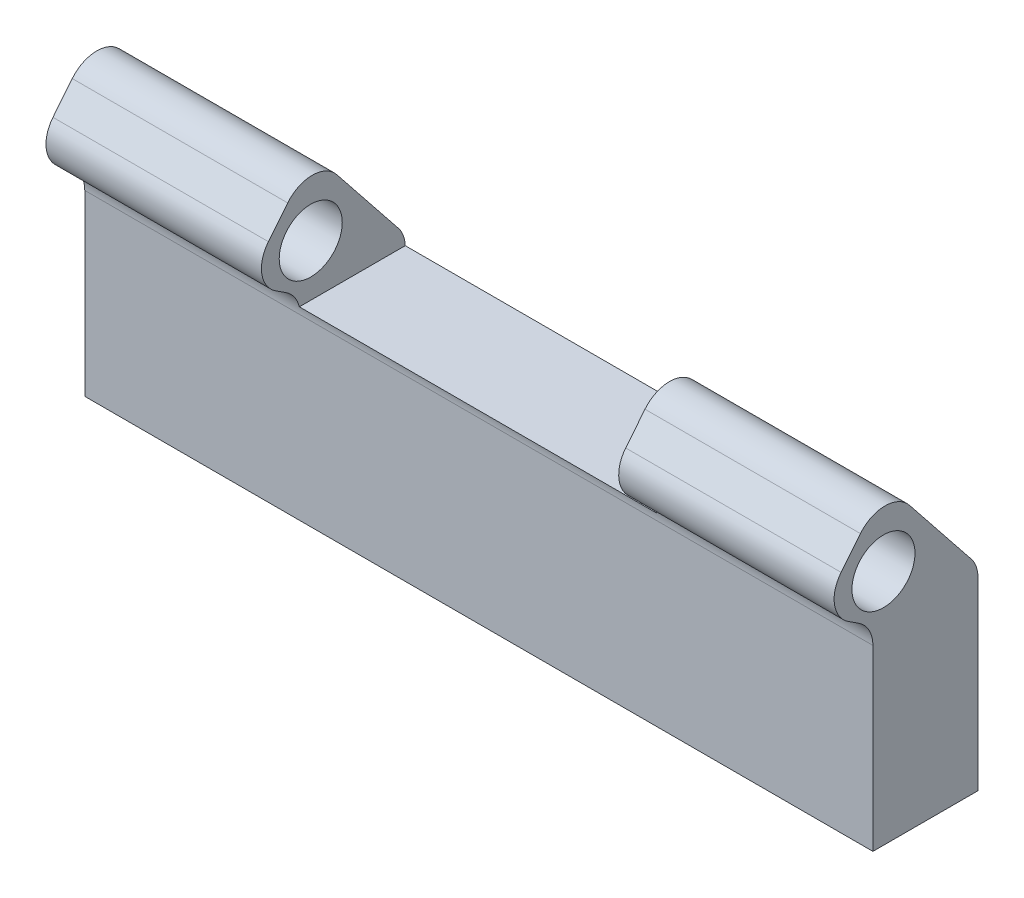
ISO-10303-21;
HEADER;
FILE_DESCRIPTION(('STEP AP214'),'2;1');
FILE_NAME('part.step','',(''),(''),'','','');
FILE_SCHEMA(('AUTOMOTIVE_DESIGN { 1 0 10303 214 1 1 1 1 }'));
ENDSEC;
DATA;
#1=APPLICATION_CONTEXT('core data for automotive mechanical design processes');
#2=APPLICATION_PROTOCOL_DEFINITION('international standard','automotive_design',2000,#1);
#3=PRODUCT_CONTEXT('',#1,'mechanical');
#4=PRODUCT('Part','Part','',(#3));
#5=PRODUCT_RELATED_PRODUCT_CATEGORY('part','',(#4));
#6=PRODUCT_DEFINITION_FORMATION('','',#4);
#7=PRODUCT_DEFINITION_CONTEXT('part definition',#1,'design');
#8=PRODUCT_DEFINITION('design','',#6,#7);
#9=PRODUCT_DEFINITION_SHAPE('','',#8);
#10=(LENGTH_UNIT() NAMED_UNIT(*) SI_UNIT(.MILLI.,.METRE.));
#11=(NAMED_UNIT(*) PLANE_ANGLE_UNIT() SI_UNIT($,.RADIAN.));
#12=(NAMED_UNIT(*) SI_UNIT($,.STERADIAN.) SOLID_ANGLE_UNIT());
#13=UNCERTAINTY_MEASURE_WITH_UNIT(LENGTH_MEASURE(1.E-05),#10,'distance_accuracy_value','');
#14=(GEOMETRIC_REPRESENTATION_CONTEXT(3) GLOBAL_UNCERTAINTY_ASSIGNED_CONTEXT((#13)) GLOBAL_UNIT_ASSIGNED_CONTEXT((#10,
#11,#12)) REPRESENTATION_CONTEXT('',''));
#15=CARTESIAN_POINT('',(0.,0.,0.));
#16=DIRECTION('',(0.,0.,1.));
#17=DIRECTION('',(1.,0.,0.));
#18=AXIS2_PLACEMENT_3D('',#15,#16,#17);
#19=CARTESIAN_POINT('',(56.3126986068911,19.4291624971245,-4.34559805034063));
#20=DIRECTION('',(0.,0.623446494740523,-0.781866016780212));
#21=DIRECTION('',(0.,0.781866016780212,0.623446494740523));
#22=AXIS2_PLACEMENT_3D('',#19,#20,#21);
#23=PLANE('',#22);
#24=DIRECTION('',(0.,-0.781866016780212,-0.623446494740523));
#25=VECTOR('',#24,1.);
#26=CARTESIAN_POINT('',(17.,19.4291624971245,-4.34559805034063));
#27=LINE('',#26,#25);
#28=CARTESIAN_POINT('',(17.,26.7718998595303,1.50937424944533));
#29=VERTEX_POINT('',#28);
#30=CARTESIAN_POINT('',(17.,19.4291624971245,-4.34559805034063));
#31=VERTEX_POINT('',#30);
#32=EDGE_CURVE('E235',#29,#31,#27,.T.);
#33=ORIENTED_EDGE('',*,*,#32,.F.);
#34=DIRECTION('',(-1.,0.,0.));
#35=VECTOR('',#34,1.);
#36=CARTESIAN_POINT('',(56.3126986068911,26.7718998595303,1.50937424944533));
#37=LINE('',#36,#35);
#38=CARTESIAN_POINT('',(37.5,26.7718998595303,1.50937424944533));
#39=VERTEX_POINT('',#38);
#40=EDGE_CURVE('E259',#39,#29,#37,.T.);
#41=ORIENTED_EDGE('',*,*,#40,.F.);
#42=DIRECTION('',(0.,0.781866016780212,0.623446494740523));
#43=VECTOR('',#42,1.);
#44=CARTESIAN_POINT('',(37.5,19.4291624971245,-4.34559805034063));
#45=LINE('',#44,#43);
#46=CARTESIAN_POINT('',(37.5,19.4291624971245,-4.34559805034063));
#47=VERTEX_POINT('',#46);
#48=EDGE_CURVE('E302',#47,#39,#45,.T.);
#49=ORIENTED_EDGE('',*,*,#48,.F.);
#50=DIRECTION('',(-1.,0.,0.));
#51=VECTOR('',#50,1.);
#52=CARTESIAN_POINT('',(56.3126986068911,19.4291624971245,-4.34559805034063));
#53=LINE('',#52,#51);
#54=EDGE_CURVE('E255',#47,#31,#53,.T.);
#55=ORIENTED_EDGE('',*,*,#54,.T.);
#56=EDGE_LOOP('',(#33,#41,#49,#55));
#57=FACE_BOUND('',#56,.T.);
#58=ADVANCED_FACE('F32',(#57),#23,.T.);
#59=CARTESIAN_POINT('',(56.3126986068911,24.9015603753087,3.85497229978599));
#60=DIRECTION('',(-1.,0.,0.));
#61=DIRECTION('',(0.,0.,1.));
#62=AXIS2_PLACEMENT_3D('',#59,#60,#61);
#63=CYLINDRICAL_SURFACE('',#62,3.00000000000003);
#64=CARTESIAN_POINT('',(17.,24.9015603753087,3.85497229978599));
#65=DIRECTION('',(1.,0.,0.));
#66=DIRECTION('',(0.,0.,-1.));
#67=AXIS2_PLACEMENT_3D('',#64,#65,#66);
#68=CIRCLE('',#67,3.00000000000003);
#69=CARTESIAN_POINT('',(17.,26.7857608849629,6.18945049403389));
#70=VERTEX_POINT('',#69);
#71=EDGE_CURVE('E288',#70,#29,#68,.F.);
#72=ORIENTED_EDGE('',*,*,#71,.F.);
#73=DIRECTION('',(-1.,0.,0.));
#74=VECTOR('',#73,1.);
#75=CARTESIAN_POINT('',(56.3126986068911,26.7857608849629,6.18945049403389));
#76=LINE('',#75,#74);
#77=CARTESIAN_POINT('',(37.5,26.7857608849629,6.18945049403389));
#78=VERTEX_POINT('',#77);
#79=EDGE_CURVE('E263',#78,#70,#76,.T.);
#80=ORIENTED_EDGE('',*,*,#79,.F.);
#81=CARTESIAN_POINT('',(37.5,24.9015603753087,3.85497229978599));
#82=DIRECTION('',(-1.,0.,0.));
#83=DIRECTION('',(0.,0.,1.));
#84=AXIS2_PLACEMENT_3D('',#81,#82,#83);
#85=CIRCLE('',#84,3.00000000000003);
#86=EDGE_CURVE('E301',#39,#78,#85,.F.);
#87=ORIENTED_EDGE('',*,*,#86,.F.);
#88=ORIENTED_EDGE('',*,*,#40,.T.);
#89=EDGE_LOOP('',(#72,#80,#87,#88));
#90=FACE_BOUND('',#89,.T.);
#91=ADVANCED_FACE('F354',(#90),#63,.T.);
#92=CARTESIAN_POINT('',(56.3126986068911,24.5098867853315,8.0263505554696));
#93=DIRECTION('',(0.,0.628066836551396,0.778159398082631));
#94=DIRECTION('',(0.,-0.778159398082631,0.628066836551396));
#95=AXIS2_PLACEMENT_3D('',#92,#93,#94);
#96=PLANE('',#95);
#97=DIRECTION('',(0.,0.778159398082631,-0.628066836551396));
#98=VECTOR('',#97,1.);
#99=CARTESIAN_POINT('',(17.,24.5098867853315,8.0263505554696));
#100=LINE('',#99,#98);
#101=CARTESIAN_POINT('',(17.,24.5098867853315,8.0263505554696));
#102=VERTEX_POINT('',#101);
#103=EDGE_CURVE('E286',#102,#70,#100,.T.);
#104=ORIENTED_EDGE('',*,*,#103,.F.);
#105=DIRECTION('',(-1.,0.,0.));
#106=VECTOR('',#105,1.);
#107=CARTESIAN_POINT('',(56.3126986068911,24.5098867853315,8.0263505554696));
#108=LINE('',#107,#106);
#109=CARTESIAN_POINT('',(37.5,24.5098867853315,8.0263505554696));
#110=VERTEX_POINT('',#109);
#111=EDGE_CURVE('E266',#110,#102,#108,.T.);
#112=ORIENTED_EDGE('',*,*,#111,.F.);
#113=DIRECTION('',(0.,-0.778159398082631,0.628066836551396));
#114=VECTOR('',#113,1.);
#115=CARTESIAN_POINT('',(37.5,24.5098867853315,8.0263505554696));
#116=LINE('',#115,#114);
#117=EDGE_CURVE('E299',#78,#110,#116,.T.);
#118=ORIENTED_EDGE('',*,*,#117,.F.);
#119=ORIENTED_EDGE('',*,*,#79,.T.);
#120=EDGE_LOOP('',(#104,#112,#118,#119));
#121=FACE_BOUND('',#120,.T.);
#122=ADVANCED_FACE('F351',(#121),#96,.T.);
#123=CARTESIAN_POINT('',(56.3126986068911,22.6256862756773,5.69187236122172));
#124=DIRECTION('',(-1.,0.,0.));
#125=DIRECTION('',(0.,0.,1.));
#126=AXIS2_PLACEMENT_3D('',#123,#124,#125);
#127=CYLINDRICAL_SURFACE('',#126,3.);
#128=CARTESIAN_POINT('',(17.,22.6256862756773,5.69187236122172));
#129=DIRECTION('',(1.,0.,0.));
#130=DIRECTION('',(0.,0.,-1.));
#131=AXIS2_PLACEMENT_3D('',#128,#129,#130);
#132=CIRCLE('',#131,3.);
#133=CARTESIAN_POINT('',(17.,20.1051302274839,7.31877039364908));
#134=VERTEX_POINT('',#133);
#135=EDGE_CURVE('E284',#134,#102,#132,.F.);
#136=ORIENTED_EDGE('',*,*,#135,.F.);
#137=DIRECTION('',(-1.,0.,0.));
#138=VECTOR('',#137,1.);
#139=CARTESIAN_POINT('',(56.3126986068911,20.1051302274839,7.31877039364908));
#140=LINE('',#139,#138);
#141=CARTESIAN_POINT('',(37.5,20.1051302274839,7.31877039364908));
#142=VERTEX_POINT('',#141);
#143=EDGE_CURVE('E187',#142,#134,#140,.T.);
#144=ORIENTED_EDGE('',*,*,#143,.F.);
#145=CARTESIAN_POINT('',(37.5,22.6256862756773,5.69187236122172));
#146=DIRECTION('',(-1.,0.,0.));
#147=DIRECTION('',(0.,0.,1.));
#148=AXIS2_PLACEMENT_3D('',#145,#146,#147);
#149=CIRCLE('',#148,3.);
#150=EDGE_CURVE('E283',#110,#142,#149,.F.);
#151=ORIENTED_EDGE('',*,*,#150,.F.);
#152=ORIENTED_EDGE('',*,*,#111,.T.);
#153=EDGE_LOOP('',(#136,#144,#151,#152));
#154=FACE_BOUND('',#153,.T.);
#155=ADVANCED_FACE('F282',(#154),#127,.T.);
#156=CARTESIAN_POINT('',(56.3126986068911,19.4947466167663,6.37310196757263));
#157=DIRECTION('',(0.,-0.840185349397773,0.54229934414246));
#158=DIRECTION('',(0.,-0.54229934414246,-0.840185349397773));
#159=AXIS2_PLACEMENT_3D('',#156,#157,#158);
#160=PLANE('',#159);
#161=DIRECTION('',(0.,0.54229934414246,0.840185349397773));
#162=VECTOR('',#161,1.);
#163=CARTESIAN_POINT('',(17.,19.4947466167663,6.37310196757263));
#164=LINE('',#163,#162);
#165=CARTESIAN_POINT('',(17.,19.4947466167663,6.37310196757263));
#166=VERTEX_POINT('',#165);
#167=EDGE_CURVE('E280',#166,#134,#164,.T.);
#168=ORIENTED_EDGE('',*,*,#167,.F.);
#169=DIRECTION('',(-1.,0.,0.));
#170=VECTOR('',#169,1.);
#171=CARTESIAN_POINT('',(56.3126986068911,19.4947466167663,6.37310196757263));
#172=LINE('',#171,#170);
#173=CARTESIAN_POINT('',(37.5,19.4947466167663,6.37310196757263));
#174=VERTEX_POINT('',#173);
#175=EDGE_CURVE('E178',#174,#166,#172,.T.);
#176=ORIENTED_EDGE('',*,*,#175,.F.);
#177=DIRECTION('',(0.,-0.54229934414246,-0.840185349397773));
#178=VECTOR('',#177,1.);
#179=CARTESIAN_POINT('',(37.5,19.4947466167663,6.37310196757263));
#180=LINE('',#179,#178);
#181=EDGE_CURVE('E281',#142,#174,#180,.T.);
#182=ORIENTED_EDGE('',*,*,#181,.F.);
#183=ORIENTED_EDGE('',*,*,#143,.T.);
#184=EDGE_LOOP('',(#168,#176,#182,#183));
#185=FACE_BOUND('',#184,.T.);
#186=ADVANCED_FACE('F279',(#185),#160,.T.);
#187=CARTESIAN_POINT('',(37.5,15.,-5.));
#188=DIRECTION('',(-1.,0.,0.));
#189=DIRECTION('',(0.,0.,1.));
#190=AXIS2_PLACEMENT_3D('',#187,#188,#189);
#191=PLANE('',#190);
#192=CARTESIAN_POINT('',(37.5,22.584588980844,3.99670705435916));
#193=DIRECTION('',(1.,0.,0.));
#194=DIRECTION('',(0.,0.,-1.));
#195=AXIS2_PLACEMENT_3D('',#192,#193,#194);
#196=CIRCLE('',#195,3.);
#197=CARTESIAN_POINT('',(37.5,22.584588980844,0.996707054359158));
#198=VERTEX_POINT('',#197);
#199=EDGE_CURVE('E432',#198,#198,#196,.T.);
#200=ORIENTED_EDGE('',*,*,#199,.F.);
#201=EDGE_LOOP('',(#200));
#202=FACE_BOUND('',#201,.T.);
#203=DIRECTION('',(0.,0.,-1.));
#204=VECTOR('',#203,1.);
#205=CARTESIAN_POINT('',(37.5,0.,-5.));
#206=LINE('',#205,#204);
#207=CARTESIAN_POINT('',(37.5,0.,5.));
#208=VERTEX_POINT('',#207);
#209=CARTESIAN_POINT('',(37.5,0.,-5.));
#210=VERTEX_POINT('',#209);
#211=EDGE_CURVE('E195',#208,#210,#206,.T.);
#212=ORIENTED_EDGE('',*,*,#211,.T.);
#213=DIRECTION('',(0.,-1.,0.));
#214=VECTOR('',#213,1.);
#215=CARTESIAN_POINT('',(37.5,15.,-5.));
#216=LINE('',#215,#214);
#217=CARTESIAN_POINT('',(37.5,17.5588230129029,-5.));
#218=VERTEX_POINT('',#217);
#219=EDGE_CURVE('E165',#218,#210,#216,.T.);
#220=ORIENTED_EDGE('',*,*,#219,.F.);
#221=CARTESIAN_POINT('',(37.5,17.558823012903,-2.));
#222=DIRECTION('',(-1.,0.,0.));
#223=DIRECTION('',(0.,0.,1.));
#224=AXIS2_PLACEMENT_3D('',#221,#222,#223);
#225=CIRCLE('',#224,3.);
#226=EDGE_CURVE('E199',#218,#47,#225,.F.);
#227=ORIENTED_EDGE('',*,*,#226,.T.);
#228=ORIENTED_EDGE('',*,*,#48,.T.);
#229=ORIENTED_EDGE('',*,*,#86,.T.);
#230=ORIENTED_EDGE('',*,*,#117,.T.);
#231=ORIENTED_EDGE('',*,*,#150,.T.);
#232=ORIENTED_EDGE('',*,*,#181,.T.);
#233=CARTESIAN_POINT('',(37.5,16.974190568573,8.));
#234=DIRECTION('',(-1.,0.,0.));
#235=DIRECTION('',(0.,0.,1.));
#236=AXIS2_PLACEMENT_3D('',#233,#234,#235);
#237=CIRCLE('',#236,3.);
#238=CARTESIAN_POINT('',(37.5,16.9741905685729,5.));
#239=VERTEX_POINT('',#238);
#240=EDGE_CURVE('E181',#174,#239,#237,.T.);
#241=ORIENTED_EDGE('',*,*,#240,.T.);
#242=DIRECTION('',(0.,-1.,0.));
#243=VECTOR('',#242,1.);
#244=CARTESIAN_POINT('',(37.5,15.,5.));
#245=LINE('',#244,#243);
#246=EDGE_CURVE('E204',#239,#208,#245,.T.);
#247=ORIENTED_EDGE('',*,*,#246,.T.);
#248=EDGE_LOOP('',(#212,#220,#227,#228,#229,#230,#231,#232,#241,#247));
#249=FACE_BOUND('',#248,.T.);
#250=ADVANCED_FACE('F34',(#202,#249),#191,.F.);
#251=CARTESIAN_POINT('',(-37.5,15.,-5.));
#252=DIRECTION('',(0.,0.,1.));
#253=DIRECTION('',(1.,0.,0.));
#254=AXIS2_PLACEMENT_3D('',#251,#252,#253);
#255=PLANE('',#254);
#256=DIRECTION('',(-1.,0.,0.));
#257=VECTOR('',#256,1.);
#258=CARTESIAN_POINT('',(-37.5,0.,-5.));
#259=LINE('',#258,#257);
#260=CARTESIAN_POINT('',(-37.5,0.,-5.));
#261=VERTEX_POINT('',#260);
#262=EDGE_CURVE('E198',#210,#261,#259,.T.);
#263=ORIENTED_EDGE('',*,*,#262,.T.);
#264=DIRECTION('',(0.,-1.,0.));
#265=VECTOR('',#264,1.);
#266=CARTESIAN_POINT('',(-37.5,15.,-5.));
#267=LINE('',#266,#265);
#268=CARTESIAN_POINT('',(-37.5,17.5588230129029,-5.));
#269=VERTEX_POINT('',#268);
#270=EDGE_CURVE('E208',#269,#261,#267,.T.);
#271=ORIENTED_EDGE('',*,*,#270,.F.);
#272=DIRECTION('',(-1.,0.,0.));
#273=VECTOR('',#272,1.);
#274=CARTESIAN_POINT('',(56.3126986068911,17.5588230129029,-5.));
#275=LINE('',#274,#273);
#276=EDGE_CURVE('E252',#218,#269,#275,.T.);
#277=ORIENTED_EDGE('',*,*,#276,.F.);
#278=ORIENTED_EDGE('',*,*,#219,.T.);
#279=EDGE_LOOP('',(#263,#271,#277,#278));
#280=FACE_BOUND('',#279,.T.);
#281=ADVANCED_FACE('F444',(#280),#255,.F.);
#282=CARTESIAN_POINT('',(-37.5,15.,-5.));
#283=DIRECTION('',(1.,0.,0.));
#284=DIRECTION('',(0.,0.,-1.));
#285=AXIS2_PLACEMENT_3D('',#282,#283,#284);
#286=PLANE('',#285);
#287=CARTESIAN_POINT('',(-37.5,22.584588980844,3.99670705435916));
#288=DIRECTION('',(1.,0.,0.));
#289=DIRECTION('',(0.,0.,-1.));
#290=AXIS2_PLACEMENT_3D('',#287,#288,#289);
#291=CIRCLE('',#290,3.);
#292=CARTESIAN_POINT('',(-37.5,22.584588980844,0.996707054359158));
#293=VERTEX_POINT('',#292);
#294=EDGE_CURVE('E172',#293,#293,#291,.T.);
#295=ORIENTED_EDGE('',*,*,#294,.T.);
#296=EDGE_LOOP('',(#295));
#297=FACE_BOUND('',#296,.T.);
#298=DIRECTION('',(0.,0.,1.));
#299=VECTOR('',#298,1.);
#300=CARTESIAN_POINT('',(-37.5,0.,-5.));
#301=LINE('',#300,#299);
#302=CARTESIAN_POINT('',(-37.5,0.,5.));
#303=VERTEX_POINT('',#302);
#304=EDGE_CURVE('E201',#261,#303,#301,.T.);
#305=ORIENTED_EDGE('',*,*,#304,.T.);
#306=DIRECTION('',(0.,-1.,0.));
#307=VECTOR('',#306,1.);
#308=CARTESIAN_POINT('',(-37.5,15.,5.));
#309=LINE('',#308,#307);
#310=CARTESIAN_POINT('',(-37.5,16.9741905685729,5.));
#311=VERTEX_POINT('',#310);
#312=EDGE_CURVE('E206',#311,#303,#309,.T.);
#313=ORIENTED_EDGE('',*,*,#312,.F.);
#314=CARTESIAN_POINT('',(-37.5,16.974190568573,8.));
#315=DIRECTION('',(1.,0.,0.));
#316=DIRECTION('',(0.,0.,-1.));
#317=AXIS2_PLACEMENT_3D('',#314,#315,#316);
#318=CIRCLE('',#317,3.);
#319=CARTESIAN_POINT('',(-37.5,19.4947466167663,6.37310196757263));
#320=VERTEX_POINT('',#319);
#321=EDGE_CURVE('E231',#311,#320,#318,.T.);
#322=ORIENTED_EDGE('',*,*,#321,.T.);
#323=DIRECTION('',(0.,0.54229934414246,0.840185349397773));
#324=VECTOR('',#323,1.);
#325=CARTESIAN_POINT('',(-37.5,19.4947466167663,6.37310196757263));
#326=LINE('',#325,#324);
#327=CARTESIAN_POINT('',(-37.5,20.1051302274839,7.31877039364908));
#328=VERTEX_POINT('',#327);
#329=EDGE_CURVE('E225',#320,#328,#326,.T.);
#330=ORIENTED_EDGE('',*,*,#329,.T.);
#331=CARTESIAN_POINT('',(-37.5,22.6256862756773,5.69187236122172));
#332=DIRECTION('',(-1.,0.,0.));
#333=DIRECTION('',(0.,0.,1.));
#334=AXIS2_PLACEMENT_3D('',#331,#332,#333);
#335=CIRCLE('',#334,3.);
#336=CARTESIAN_POINT('',(-37.5,24.5098867853315,8.0263505554696));
#337=VERTEX_POINT('',#336);
#338=EDGE_CURVE('E230',#328,#337,#335,.T.);
#339=ORIENTED_EDGE('',*,*,#338,.T.);
#340=DIRECTION('',(0.,0.778159398082631,-0.628066836551396));
#341=VECTOR('',#340,1.);
#342=CARTESIAN_POINT('',(-37.5,24.5098867853315,8.0263505554696));
#343=LINE('',#342,#341);
#344=CARTESIAN_POINT('',(-37.5,26.7857608849629,6.18945049403389));
#345=VERTEX_POINT('',#344);
#346=EDGE_CURVE('E241',#337,#345,#343,.T.);
#347=ORIENTED_EDGE('',*,*,#346,.T.);
#348=CARTESIAN_POINT('',(-37.5,24.9015603753087,3.85497229978599));
#349=DIRECTION('',(-1.,0.,0.));
#350=DIRECTION('',(0.,0.,-1.));
#351=AXIS2_PLACEMENT_3D('',#348,#349,#350);
#352=CIRCLE('',#351,3.00000000000003);
#353=CARTESIAN_POINT('',(-37.5,26.7718998595303,1.50937424944533));
#354=VERTEX_POINT('',#353);
#355=EDGE_CURVE('E244',#345,#354,#352,.T.);
#356=ORIENTED_EDGE('',*,*,#355,.T.);
#357=DIRECTION('',(0.,-0.781866016780212,-0.623446494740523));
#358=VECTOR('',#357,1.);
#359=CARTESIAN_POINT('',(-37.5,19.4291624971245,-4.34559805034063));
#360=LINE('',#359,#358);
#361=CARTESIAN_POINT('',(-37.5,19.4291624971245,-4.34559805034063));
#362=VERTEX_POINT('',#361);
#363=EDGE_CURVE('E247',#354,#362,#360,.T.);
#364=ORIENTED_EDGE('',*,*,#363,.T.);
#365=CARTESIAN_POINT('',(-37.5,17.558823012903,-2.));
#366=DIRECTION('',(-1.,0.,0.));
#367=DIRECTION('',(0.,0.,-1.));
#368=AXIS2_PLACEMENT_3D('',#365,#366,#367);
#369=CIRCLE('',#368,3.);
#370=EDGE_CURVE('E194',#362,#269,#369,.T.);
#371=ORIENTED_EDGE('',*,*,#370,.T.);
#372=ORIENTED_EDGE('',*,*,#270,.T.);
#373=EDGE_LOOP('',(#305,#313,#322,#330,#339,#347,#356,#364,#371,#372));
#374=FACE_BOUND('',#373,.T.);
#375=ADVANCED_FACE('F233',(#297,#374),#286,.F.);
#376=CARTESIAN_POINT('',(-37.5,15.,5.));
#377=DIRECTION('',(0.,0.,-1.));
#378=DIRECTION('',(-1.,0.,0.));
#379=AXIS2_PLACEMENT_3D('',#376,#377,#378);
#380=PLANE('',#379);
#381=DIRECTION('',(1.,0.,0.));
#382=VECTOR('',#381,1.);
#383=CARTESIAN_POINT('',(-37.5,0.,5.));
#384=LINE('',#383,#382);
#385=EDGE_CURVE('E56',#303,#208,#384,.T.);
#386=ORIENTED_EDGE('',*,*,#385,.T.);
#387=ORIENTED_EDGE('',*,*,#246,.F.);
#388=DIRECTION('',(-1.,0.,0.));
#389=VECTOR('',#388,1.);
#390=CARTESIAN_POINT('',(56.3126986068911,16.9741905685729,5.));
#391=LINE('',#390,#389);
#392=EDGE_CURVE('E189',#239,#311,#391,.T.);
#393=ORIENTED_EDGE('',*,*,#392,.T.);
#394=ORIENTED_EDGE('',*,*,#312,.T.);
#395=EDGE_LOOP('',(#386,#387,#393,#394));
#396=FACE_BOUND('',#395,.T.);
#397=ADVANCED_FACE('F371',(#396),#380,.F.);
#398=CARTESIAN_POINT('',(0.,0.,0.));
#399=DIRECTION('',(0.,1.,0.));
#400=DIRECTION('',(0.,0.,1.));
#401=AXIS2_PLACEMENT_3D('',#398,#399,#400);
#402=PLANE('',#401);
#403=CARTESIAN_POINT('',(25.,0.,0.));
#404=DIRECTION('',(0.,-1.,0.));
#405=DIRECTION('',(0.,0.,-1.));
#406=AXIS2_PLACEMENT_3D('',#403,#404,#405);
#407=CIRCLE('',#406,2.99999999999999);
#408=CARTESIAN_POINT('',(25.,0.,-2.99999999999999));
#409=VERTEX_POINT('',#408);
#410=EDGE_CURVE('E417',#409,#409,#407,.T.);
#411=ORIENTED_EDGE('',*,*,#410,.F.);
#412=EDGE_LOOP('',(#411));
#413=FACE_BOUND('',#412,.T.);
#414=CARTESIAN_POINT('',(-25.,0.,0.));
#415=DIRECTION('',(0.,-1.,0.));
#416=DIRECTION('',(0.,0.,-1.));
#417=AXIS2_PLACEMENT_3D('',#414,#415,#416);
#418=CIRCLE('',#417,3.);
#419=CARTESIAN_POINT('',(-25.,0.,-3.));
#420=VERTEX_POINT('',#419);
#421=EDGE_CURVE('E428',#420,#420,#418,.T.);
#422=ORIENTED_EDGE('',*,*,#421,.F.);
#423=EDGE_LOOP('',(#422));
#424=FACE_BOUND('',#423,.T.);
#425=CARTESIAN_POINT('',(0.,0.,0.));
#426=DIRECTION('',(0.,-1.,0.));
#427=DIRECTION('',(0.,0.,-1.));
#428=AXIS2_PLACEMENT_3D('',#425,#426,#427);
#429=CIRCLE('',#428,3.);
#430=CARTESIAN_POINT('',(0.,0.,-3.));
#431=VERTEX_POINT('',#430);
#432=EDGE_CURVE('E416',#431,#431,#429,.T.);
#433=ORIENTED_EDGE('',*,*,#432,.F.);
#434=EDGE_LOOP('',(#433));
#435=FACE_BOUND('',#434,.T.);
#436=ORIENTED_EDGE('',*,*,#211,.F.);
#437=ORIENTED_EDGE('',*,*,#385,.F.);
#438=ORIENTED_EDGE('',*,*,#304,.F.);
#439=ORIENTED_EDGE('',*,*,#262,.F.);
#440=EDGE_LOOP('',(#436,#437,#438,#439));
#441=FACE_BOUND('',#440,.T.);
#442=ADVANCED_FACE('F367',(#413,#424,#435,#441),#402,.F.);
#443=CARTESIAN_POINT('',(56.3126986068911,17.558823012903,-2.));
#444=DIRECTION('',(-1.,0.,0.));
#445=DIRECTION('',(0.,0.,1.));
#446=AXIS2_PLACEMENT_3D('',#443,#444,#445);
#447=CYLINDRICAL_SURFACE('',#446,3.);
#448=CARTESIAN_POINT('',(17.,17.558823012903,-2.));
#449=DIRECTION('',(1.,0.,0.));
#450=DIRECTION('',(0.,0.,-1.));
#451=AXIS2_PLACEMENT_3D('',#448,#449,#450);
#452=CIRCLE('',#451,3.);
#453=CARTESIAN_POINT('',(17.,17.6699099276443,-4.99794257739758));
#454=VERTEX_POINT('',#453);
#455=EDGE_CURVE('E171',#31,#454,#452,.F.);
#456=ORIENTED_EDGE('',*,*,#455,.F.);
#457=ORIENTED_EDGE('',*,*,#54,.F.);
#458=ORIENTED_EDGE('',*,*,#226,.F.);
#459=ORIENTED_EDGE('',*,*,#276,.T.);
#460=ORIENTED_EDGE('',*,*,#370,.F.);
#461=CARTESIAN_POINT('',(-17.,19.4291624971245,-4.34559805034063));
#462=VERTEX_POINT('',#461);
#463=EDGE_CURVE('E258',#462,#362,#53,.T.);
#464=ORIENTED_EDGE('',*,*,#463,.F.);
#465=CARTESIAN_POINT('',(-17.,17.558823012903,-2.));
#466=DIRECTION('',(-1.,0.,0.));
#467=DIRECTION('',(0.,0.,1.));
#468=AXIS2_PLACEMENT_3D('',#465,#466,#467);
#469=CIRCLE('',#468,3.);
#470=CARTESIAN_POINT('',(-17.,17.6699099276443,-4.99794257739758));
#471=VERTEX_POINT('',#470);
#472=EDGE_CURVE('E290',#471,#462,#469,.F.);
#473=ORIENTED_EDGE('',*,*,#472,.F.);
#474=DIRECTION('',(-1.,0.,0.));
#475=VECTOR('',#474,1.);
#476=CARTESIAN_POINT('',(56.3126986068911,17.6699099276443,-4.99794257739758));
#477=LINE('',#476,#475);
#478=EDGE_CURVE('E314',#454,#471,#477,.T.);
#479=ORIENTED_EDGE('',*,*,#478,.F.);
#480=EDGE_LOOP('',(#456,#457,#458,#459,#460,#464,#473,#479));
#481=FACE_BOUND('',#480,.T.);
#482=ADVANCED_FACE('F313',(#481),#447,.T.);
#483=DIRECTION('',(0.,0.781866016780212,0.623446494740523));
#484=VECTOR('',#483,1.);
#485=CARTESIAN_POINT('',(-17.,19.4291624971245,-4.34559805034063));
#486=LINE('',#485,#484);
#487=CARTESIAN_POINT('',(-17.,26.7718998595303,1.50937424944533));
#488=VERTEX_POINT('',#487);
#489=EDGE_CURVE('E326',#462,#488,#486,.T.);
#490=ORIENTED_EDGE('',*,*,#489,.F.);
#491=ORIENTED_EDGE('',*,*,#463,.T.);
#492=ORIENTED_EDGE('',*,*,#363,.F.);
#493=EDGE_CURVE('E262',#488,#354,#37,.T.);
#494=ORIENTED_EDGE('',*,*,#493,.F.);
#495=EDGE_LOOP('',(#490,#491,#492,#494));
#496=FACE_BOUND('',#495,.T.);
#497=ADVANCED_FACE('F331',(#496),#23,.T.);
#498=CARTESIAN_POINT('',(-17.,24.9015603753087,3.85497229978599));
#499=DIRECTION('',(-1.,0.,0.));
#500=DIRECTION('',(0.,0.,1.));
#501=AXIS2_PLACEMENT_3D('',#498,#499,#500);
#502=CIRCLE('',#501,3.00000000000003);
#503=CARTESIAN_POINT('',(-17.,26.7857608849629,6.18945049403389));
#504=VERTEX_POINT('',#503);
#505=EDGE_CURVE('E324',#488,#504,#502,.F.);
#506=ORIENTED_EDGE('',*,*,#505,.F.);
#507=ORIENTED_EDGE('',*,*,#493,.T.);
#508=ORIENTED_EDGE('',*,*,#355,.F.);
#509=EDGE_CURVE('E265',#504,#345,#76,.T.);
#510=ORIENTED_EDGE('',*,*,#509,.F.);
#511=EDGE_LOOP('',(#506,#507,#508,#510));
#512=FACE_BOUND('',#511,.T.);
#513=ADVANCED_FACE('F338',(#512),#63,.T.);
#514=DIRECTION('',(0.,-0.778159398082631,0.628066836551396));
#515=VECTOR('',#514,1.);
#516=CARTESIAN_POINT('',(-17.,24.5098867853315,8.0263505554696));
#517=LINE('',#516,#515);
#518=CARTESIAN_POINT('',(-17.,24.5098867853315,8.0263505554696));
#519=VERTEX_POINT('',#518);
#520=EDGE_CURVE('E322',#504,#519,#517,.T.);
#521=ORIENTED_EDGE('',*,*,#520,.F.);
#522=ORIENTED_EDGE('',*,*,#509,.T.);
#523=ORIENTED_EDGE('',*,*,#346,.F.);
#524=EDGE_CURVE('E268',#519,#337,#108,.T.);
#525=ORIENTED_EDGE('',*,*,#524,.F.);
#526=EDGE_LOOP('',(#521,#522,#523,#525));
#527=FACE_BOUND('',#526,.T.);
#528=ADVANCED_FACE('F341',(#527),#96,.T.);
#529=CARTESIAN_POINT('',(-17.,22.6256862756773,5.69187236122172));
#530=DIRECTION('',(-1.,0.,0.));
#531=DIRECTION('',(0.,0.,1.));
#532=AXIS2_PLACEMENT_3D('',#529,#530,#531);
#533=CIRCLE('',#532,3.);
#534=CARTESIAN_POINT('',(-17.,20.1051302274839,7.31877039364908));
#535=VERTEX_POINT('',#534);
#536=EDGE_CURVE('E317',#519,#535,#533,.F.);
#537=ORIENTED_EDGE('',*,*,#536,.F.);
#538=ORIENTED_EDGE('',*,*,#524,.T.);
#539=ORIENTED_EDGE('',*,*,#338,.F.);
#540=EDGE_CURVE('E184',#535,#328,#140,.T.);
#541=ORIENTED_EDGE('',*,*,#540,.F.);
#542=EDGE_LOOP('',(#537,#538,#539,#541));
#543=FACE_BOUND('',#542,.T.);
#544=ADVANCED_FACE('F342',(#543),#127,.T.);
#545=DIRECTION('',(0.,-0.54229934414246,-0.840185349397773));
#546=VECTOR('',#545,1.);
#547=CARTESIAN_POINT('',(-17.,19.4947466167663,6.37310196757263));
#548=LINE('',#547,#546);
#549=CARTESIAN_POINT('',(-17.,19.4947466167663,6.37310196757263));
#550=VERTEX_POINT('',#549);
#551=EDGE_CURVE('E217',#535,#550,#548,.T.);
#552=ORIENTED_EDGE('',*,*,#551,.F.);
#553=ORIENTED_EDGE('',*,*,#540,.T.);
#554=ORIENTED_EDGE('',*,*,#329,.F.);
#555=EDGE_CURVE('E185',#550,#320,#172,.T.);
#556=ORIENTED_EDGE('',*,*,#555,.F.);
#557=EDGE_LOOP('',(#552,#553,#554,#556));
#558=FACE_BOUND('',#557,.T.);
#559=ADVANCED_FACE('F222',(#558),#160,.T.);
#560=CARTESIAN_POINT('',(56.3126986068911,16.974190568573,8.));
#561=DIRECTION('',(-1.,0.,0.));
#562=DIRECTION('',(0.,0.,1.));
#563=AXIS2_PLACEMENT_3D('',#560,#561,#562);
#564=CYLINDRICAL_SURFACE('',#563,3.);
#565=CARTESIAN_POINT('',(17.,16.974190568573,8.));
#566=DIRECTION('',(1.,0.,0.));
#567=DIRECTION('',(0.,0.,-1.));
#568=AXIS2_PLACEMENT_3D('',#565,#566,#567);
#569=CIRCLE('',#568,3.);
#570=CARTESIAN_POINT('',(17.,17.6699099276443,5.08178572181319));
#571=VERTEX_POINT('',#570);
#572=EDGE_CURVE('E11',#571,#166,#569,.T.);
#573=ORIENTED_EDGE('',*,*,#572,.F.);
#574=DIRECTION('',(-1.,0.,0.));
#575=VECTOR('',#574,1.);
#576=CARTESIAN_POINT('',(56.3126986068911,17.6699099276443,5.08178572181319));
#577=LINE('',#576,#575);
#578=CARTESIAN_POINT('',(-17.,17.6699099276443,5.08178572181319));
#579=VERTEX_POINT('',#578);
#580=EDGE_CURVE('E157',#579,#571,#577,.F.);
#581=ORIENTED_EDGE('',*,*,#580,.F.);
#582=CARTESIAN_POINT('',(-17.,16.974190568573,8.));
#583=DIRECTION('',(-1.,0.,0.));
#584=DIRECTION('',(0.,0.,1.));
#585=AXIS2_PLACEMENT_3D('',#582,#583,#584);
#586=CIRCLE('',#585,3.);
#587=EDGE_CURVE('E41',#550,#579,#586,.T.);
#588=ORIENTED_EDGE('',*,*,#587,.F.);
#589=ORIENTED_EDGE('',*,*,#555,.T.);
#590=ORIENTED_EDGE('',*,*,#321,.F.);
#591=ORIENTED_EDGE('',*,*,#392,.F.);
#592=ORIENTED_EDGE('',*,*,#240,.F.);
#593=ORIENTED_EDGE('',*,*,#175,.T.);
#594=EDGE_LOOP('',(#573,#581,#588,#589,#590,#591,#592,#593));
#595=FACE_BOUND('',#594,.T.);
#596=ADVANCED_FACE('F175',(#595),#564,.F.);
#597=CARTESIAN_POINT('',(17.,17.6699099276443,48.));
#598=DIRECTION('',(1.,0.,0.));
#599=DIRECTION('',(0.,0.,-1.));
#600=AXIS2_PLACEMENT_3D('',#597,#598,#599);
#601=PLANE('',#600);
#602=CARTESIAN_POINT('',(17.,22.584588980844,3.99670705435916));
#603=DIRECTION('',(1.,0.,0.));
#604=DIRECTION('',(0.,0.,-1.));
#605=AXIS2_PLACEMENT_3D('',#602,#603,#604);
#606=CIRCLE('',#605,3.);
#607=CARTESIAN_POINT('',(17.,22.584588980844,0.996707054359158));
#608=VERTEX_POINT('',#607);
#609=EDGE_CURVE('E436',#608,#608,#606,.T.);
#610=ORIENTED_EDGE('',*,*,#609,.T.);
#611=EDGE_LOOP('',(#610));
#612=FACE_BOUND('',#611,.T.);
#613=ORIENTED_EDGE('',*,*,#455,.T.);
#614=DIRECTION('',(0.,0.,-1.));
#615=VECTOR('',#614,1.);
#616=CARTESIAN_POINT('',(17.,17.6699099276443,48.));
#617=LINE('',#616,#615);
#618=EDGE_CURVE('E160',#571,#454,#617,.T.);
#619=ORIENTED_EDGE('',*,*,#618,.F.);
#620=ORIENTED_EDGE('',*,*,#572,.T.);
#621=ORIENTED_EDGE('',*,*,#167,.T.);
#622=ORIENTED_EDGE('',*,*,#135,.T.);
#623=ORIENTED_EDGE('',*,*,#103,.T.);
#624=ORIENTED_EDGE('',*,*,#71,.T.);
#625=ORIENTED_EDGE('',*,*,#32,.T.);
#626=EDGE_LOOP('',(#613,#619,#620,#621,#622,#623,#624,#625));
#627=FACE_BOUND('',#626,.T.);
#628=ADVANCED_FACE('F168',(#612,#627),#601,.F.);
#629=CARTESIAN_POINT('',(-17.,17.6699099276443,48.));
#630=DIRECTION('',(-1.,0.,0.));
#631=DIRECTION('',(0.,0.,1.));
#632=AXIS2_PLACEMENT_3D('',#629,#630,#631);
#633=PLANE('',#632);
#634=CARTESIAN_POINT('',(-17.,22.584588980844,3.99670705435916));
#635=DIRECTION('',(-1.,0.,0.));
#636=DIRECTION('',(0.,0.,1.));
#637=AXIS2_PLACEMENT_3D('',#634,#635,#636);
#638=CIRCLE('',#637,3.);
#639=CARTESIAN_POINT('',(-17.,22.584588980844,6.99670705435916));
#640=VERTEX_POINT('',#639);
#641=EDGE_CURVE('E36',#640,#640,#638,.T.);
#642=ORIENTED_EDGE('',*,*,#641,.T.);
#643=EDGE_LOOP('',(#642));
#644=FACE_BOUND('',#643,.T.);
#645=ORIENTED_EDGE('',*,*,#472,.T.);
#646=ORIENTED_EDGE('',*,*,#489,.T.);
#647=ORIENTED_EDGE('',*,*,#505,.T.);
#648=ORIENTED_EDGE('',*,*,#520,.T.);
#649=ORIENTED_EDGE('',*,*,#536,.T.);
#650=ORIENTED_EDGE('',*,*,#551,.T.);
#651=ORIENTED_EDGE('',*,*,#587,.T.);
#652=DIRECTION('',(0.,0.,-1.));
#653=VECTOR('',#652,1.);
#654=CARTESIAN_POINT('',(-17.,17.6699099276443,48.));
#655=LINE('',#654,#653);
#656=EDGE_CURVE('E48',#579,#471,#655,.T.);
#657=ORIENTED_EDGE('',*,*,#656,.T.);
#658=EDGE_LOOP('',(#645,#646,#647,#648,#649,#650,#651,#657));
#659=FACE_BOUND('',#658,.T.);
#660=ADVANCED_FACE('F214',(#644,#659),#633,.F.);
#661=CARTESIAN_POINT('',(-17.,17.6699099276443,48.));
#662=DIRECTION('',(0.,-1.,0.));
#663=DIRECTION('',(0.,0.,-1.));
#664=AXIS2_PLACEMENT_3D('',#661,#662,#663);
#665=PLANE('',#664);
#666=ORIENTED_EDGE('',*,*,#478,.T.);
#667=ORIENTED_EDGE('',*,*,#656,.F.);
#668=ORIENTED_EDGE('',*,*,#580,.T.);
#669=ORIENTED_EDGE('',*,*,#618,.T.);
#670=EDGE_LOOP('',(#666,#667,#668,#669));
#671=FACE_BOUND('',#670,.T.);
#672=ADVANCED_FACE('F159',(#671),#665,.F.);
#673=CARTESIAN_POINT('',(-44.5,22.584588980844,3.99670705435916));
#674=DIRECTION('',(1.,0.,0.));
#675=DIRECTION('',(0.,0.,-1.));
#676=AXIS2_PLACEMENT_3D('',#673,#674,#675);
#677=CYLINDRICAL_SURFACE('',#676,3.);
#678=ORIENTED_EDGE('',*,*,#641,.F.);
#679=EDGE_LOOP('',(#678));
#680=FACE_BOUND('',#679,.T.);
#681=ORIENTED_EDGE('',*,*,#294,.F.);
#682=EDGE_LOOP('',(#681));
#683=FACE_BOUND('',#682,.T.);
#684=ADVANCED_FACE('F380',(#680,#683),#677,.F.);
#685=ORIENTED_EDGE('',*,*,#199,.T.);
#686=EDGE_LOOP('',(#685));
#687=FACE_BOUND('',#686,.T.);
#688=ORIENTED_EDGE('',*,*,#609,.F.);
#689=EDGE_LOOP('',(#688));
#690=FACE_BOUND('',#689,.T.);
#691=ADVANCED_FACE('F386',(#687,#690),#677,.F.);
#692=CARTESIAN_POINT('',(0.,6.00000000000002,0.));
#693=DIRECTION('',(0.,-1.,0.));
#694=DIRECTION('',(0.,0.,-1.));
#695=AXIS2_PLACEMENT_3D('',#692,#693,#694);
#696=CYLINDRICAL_SURFACE('',#695,3.);
#697=CARTESIAN_POINT('',(0.,6.00000000000002,0.));
#698=DIRECTION('',(0.,-1.,0.));
#699=DIRECTION('',(0.,0.,-1.));
#700=AXIS2_PLACEMENT_3D('',#697,#698,#699);
#701=CIRCLE('',#700,3.);
#702=CARTESIAN_POINT('',(0.,6.00000000000002,-3.));
#703=VERTEX_POINT('',#702);
#704=EDGE_CURVE('E420',#703,#703,#701,.T.);
#705=CARTESIAN_POINT('',(0.,6.00000000000002,-3.));
#706=CARTESIAN_POINT('',(0.,5.93750000000002,-3.));
#707=CARTESIAN_POINT('',(0.,5.87500000000002,-3.));
#708=CARTESIAN_POINT('',(0.,5.75000000000002,-3.));
#709=CARTESIAN_POINT('',(0.,5.68750000000002,-3.));
#710=CARTESIAN_POINT('',(0.,5.56250000000002,-3.));
#711=CARTESIAN_POINT('',(0.,5.50000000000002,-3.));
#712=CARTESIAN_POINT('',(0.,5.37500000000002,-3.));
#713=CARTESIAN_POINT('',(0.,5.31250000000002,-3.));
#714=CARTESIAN_POINT('',(0.,5.18750000000002,-3.));
#715=CARTESIAN_POINT('',(0.,5.12500000000002,-3.));
#716=CARTESIAN_POINT('',(0.,5.00000000000002,-3.));
#717=CARTESIAN_POINT('',(0.,4.93750000000002,-3.));
#718=CARTESIAN_POINT('',(0.,4.81250000000002,-3.));
#719=CARTESIAN_POINT('',(0.,4.75000000000001,-3.));
#720=CARTESIAN_POINT('',(0.,4.62500000000001,-3.));
#721=CARTESIAN_POINT('',(0.,4.56250000000001,-3.));
#722=CARTESIAN_POINT('',(0.,4.43750000000001,-3.));
#723=CARTESIAN_POINT('',(0.,4.37500000000001,-3.));
#724=CARTESIAN_POINT('',(0.,4.25000000000001,-3.));
#725=CARTESIAN_POINT('',(0.,4.18750000000001,-3.));
#726=CARTESIAN_POINT('',(0.,4.06250000000001,-3.));
#727=CARTESIAN_POINT('',(0.,4.00000000000001,-3.));
#728=CARTESIAN_POINT('',(0.,3.87500000000001,-3.));
#729=CARTESIAN_POINT('',(0.,3.81250000000001,-3.));
#730=CARTESIAN_POINT('',(0.,3.68750000000001,-3.));
#731=CARTESIAN_POINT('',(0.,3.62500000000001,-3.));
#732=CARTESIAN_POINT('',(0.,3.50000000000001,-3.));
#733=CARTESIAN_POINT('',(0.,3.43750000000001,-3.));
#734=CARTESIAN_POINT('',(0.,3.31250000000001,-3.));
#735=CARTESIAN_POINT('',(0.,3.25000000000001,-3.));
#736=CARTESIAN_POINT('',(0.,3.12500000000001,-3.));
#737=CARTESIAN_POINT('',(0.,3.06250000000001,-3.));
#738=CARTESIAN_POINT('',(0.,2.93750000000001,-3.));
#739=CARTESIAN_POINT('',(0.,2.87500000000001,-3.));
#740=CARTESIAN_POINT('',(0.,2.75000000000001,-3.));
#741=CARTESIAN_POINT('',(0.,2.68750000000001,-3.));
#742=CARTESIAN_POINT('',(0.,2.56250000000001,-3.));
#743=CARTESIAN_POINT('',(0.,2.50000000000001,-3.));
#744=CARTESIAN_POINT('',(0.,2.37500000000001,-3.));
#745=CARTESIAN_POINT('',(0.,2.31250000000001,-3.));
#746=CARTESIAN_POINT('',(0.,2.18750000000001,-3.));
#747=CARTESIAN_POINT('',(0.,2.12500000000001,-3.));
#748=CARTESIAN_POINT('',(0.,2.00000000000001,-3.));
#749=CARTESIAN_POINT('',(0.,1.93750000000001,-3.));
#750=CARTESIAN_POINT('',(0.,1.81250000000001,-3.));
#751=CARTESIAN_POINT('',(0.,1.75000000000001,-3.));
#752=CARTESIAN_POINT('',(0.,1.625,-3.));
#753=CARTESIAN_POINT('',(0.,1.5625,-3.));
#754=CARTESIAN_POINT('',(0.,1.4375,-3.));
#755=CARTESIAN_POINT('',(0.,1.375,-3.));
#756=CARTESIAN_POINT('',(0.,1.25,-3.));
#757=CARTESIAN_POINT('',(0.,1.1875,-3.));
#758=CARTESIAN_POINT('',(0.,1.0625,-3.));
#759=CARTESIAN_POINT('',(0.,1.,-3.));
#760=CARTESIAN_POINT('',(0.,0.875000000000003,-3.));
#761=CARTESIAN_POINT('',(0.,0.812500000000002,-3.));
#762=CARTESIAN_POINT('',(0.,0.687500000000002,-3.));
#763=CARTESIAN_POINT('',(0.,0.625000000000002,-3.));
#764=CARTESIAN_POINT('',(0.,0.500000000000002,-3.));
#765=CARTESIAN_POINT('',(0.,0.437500000000002,-3.));
#766=CARTESIAN_POINT('',(0.,0.312500000000001,-3.));
#767=CARTESIAN_POINT('',(0.,0.250000000000001,-3.));
#768=CARTESIAN_POINT('',(0.,0.125,-3.));
#769=CARTESIAN_POINT('',(0.,0.0625,-3.));
#770=CARTESIAN_POINT('',(0.,0.,-3.));
#771=B_SPLINE_CURVE_WITH_KNOTS('',3,(#705,#706,#707,#708,#709,#710,#711,#712,#713,#714,#715,
#716,#717,#718,#719,#720,#721,#722,#723,#724,#725,#726,#727,#728,#729,#730,#731,#732,#733,#734,
#735,#736,#737,#738,#739,#740,#741,#742,#743,#744,#745,#746,#747,#748,#749,#750,#751,#752,#753,
#754,#755,#756,#757,#758,#759,#760,#761,#762,#763,#764,#765,#766,#767,#768,#769,#770),
.UNSPECIFIED.,.F.,.F.,(4,2,2,2,2,2,2,2,2,2,2,2,2,2,2,2,2,2,2,2,2,2,2,2,2,2,2,2,2,2,2,2,4),(0.,
0.1875,0.375,0.562500000000001,0.750000000000002,0.937500000000003,1.125,1.3125,1.5,1.6875,
1.87500000000001,2.06250000000001,2.25000000000001,2.43750000000001,2.62500000000001,
2.81250000000001,3.00000000000001,3.18750000000001,3.37500000000001,3.56250000000001,
3.75000000000001,3.93750000000001,4.12500000000001,4.31250000000001,4.50000000000001,
4.68750000000001,4.87500000000002,5.06250000000002,5.25000000000002,5.43750000000002,
5.62500000000002,5.81250000000002,6.00000000000002),.UNSPECIFIED.);
#772=EDGE_CURVE('BSEAM388',#703,#431,#771,.T.);
#773=ORIENTED_EDGE('',*,*,#704,.F.);
#774=ORIENTED_EDGE('',*,*,#432,.T.);
#775=ORIENTED_EDGE('',*,*,#772,.T.);
#776=ORIENTED_EDGE('',*,*,#772,.F.);
#777=EDGE_LOOP('',(#773,#775,#774,#776));
#778=FACE_BOUND('',#777,.T.);
#779=ADVANCED_FACE('F388',(#778),#696,.F.);
#780=CARTESIAN_POINT('',(0.,6.00000000000002,0.));
#781=DIRECTION('',(0.,-1.,0.));
#782=DIRECTION('',(0.,0.,-1.));
#783=AXIS2_PLACEMENT_3D('',#780,#781,#782);
#784=PLANE('',#783);
#785=ORIENTED_EDGE('',*,*,#704,.T.);
#786=EDGE_LOOP('',(#785));
#787=FACE_BOUND('',#786,.T.);
#788=ADVANCED_FACE('F391',(#787),#784,.T.);
#789=CARTESIAN_POINT('',(-25.,6.00000000000002,0.));
#790=DIRECTION('',(0.,-1.,0.));
#791=DIRECTION('',(0.,0.,-1.));
#792=AXIS2_PLACEMENT_3D('',#789,#790,#791);
#793=CYLINDRICAL_SURFACE('',#792,3.);
#794=CARTESIAN_POINT('',(-25.,6.00000000000002,0.));
#795=DIRECTION('',(0.,-1.,0.));
#796=DIRECTION('',(0.,0.,-1.));
#797=AXIS2_PLACEMENT_3D('',#794,#795,#796);
#798=CIRCLE('',#797,3.);
#799=CARTESIAN_POINT('',(-25.,6.00000000000002,-3.));
#800=VERTEX_POINT('',#799);
#801=EDGE_CURVE('E423',#800,#800,#798,.T.);
#802=CARTESIAN_POINT('',(-25.,6.00000000000002,-3.));
#803=CARTESIAN_POINT('',(-25.,5.93750000000002,-3.));
#804=CARTESIAN_POINT('',(-25.,5.87500000000002,-3.));
#805=CARTESIAN_POINT('',(-25.,5.75000000000002,-3.));
#806=CARTESIAN_POINT('',(-25.,5.68750000000002,-3.));
#807=CARTESIAN_POINT('',(-25.,5.56250000000002,-3.));
#808=CARTESIAN_POINT('',(-25.,5.50000000000002,-3.));
#809=CARTESIAN_POINT('',(-25.,5.37500000000002,-3.));
#810=CARTESIAN_POINT('',(-25.,5.31250000000002,-3.));
#811=CARTESIAN_POINT('',(-25.,5.18750000000002,-3.));
#812=CARTESIAN_POINT('',(-25.,5.12500000000002,-3.));
#813=CARTESIAN_POINT('',(-25.,5.00000000000002,-3.));
#814=CARTESIAN_POINT('',(-25.,4.93750000000002,-3.));
#815=CARTESIAN_POINT('',(-25.,4.81250000000002,-3.));
#816=CARTESIAN_POINT('',(-25.,4.75000000000001,-3.));
#817=CARTESIAN_POINT('',(-25.,4.62500000000001,-3.));
#818=CARTESIAN_POINT('',(-25.,4.56250000000001,-3.));
#819=CARTESIAN_POINT('',(-25.,4.43750000000001,-3.));
#820=CARTESIAN_POINT('',(-25.,4.37500000000001,-3.));
#821=CARTESIAN_POINT('',(-25.,4.25000000000001,-3.));
#822=CARTESIAN_POINT('',(-25.,4.18750000000001,-3.));
#823=CARTESIAN_POINT('',(-25.,4.06250000000001,-3.));
#824=CARTESIAN_POINT('',(-25.,4.00000000000001,-3.));
#825=CARTESIAN_POINT('',(-25.,3.87500000000001,-3.));
#826=CARTESIAN_POINT('',(-25.,3.81250000000001,-3.));
#827=CARTESIAN_POINT('',(-25.,3.68750000000001,-3.));
#828=CARTESIAN_POINT('',(-25.,3.62500000000001,-3.));
#829=CARTESIAN_POINT('',(-25.,3.50000000000001,-3.));
#830=CARTESIAN_POINT('',(-25.,3.43750000000001,-3.));
#831=CARTESIAN_POINT('',(-25.,3.31250000000001,-3.));
#832=CARTESIAN_POINT('',(-25.,3.25000000000001,-3.));
#833=CARTESIAN_POINT('',(-25.,3.12500000000001,-3.));
#834=CARTESIAN_POINT('',(-25.,3.06250000000001,-3.));
#835=CARTESIAN_POINT('',(-25.,2.93750000000001,-3.));
#836=CARTESIAN_POINT('',(-25.,2.87500000000001,-3.));
#837=CARTESIAN_POINT('',(-25.,2.75000000000001,-3.));
#838=CARTESIAN_POINT('',(-25.,2.68750000000001,-3.));
#839=CARTESIAN_POINT('',(-25.,2.56250000000001,-3.));
#840=CARTESIAN_POINT('',(-25.,2.50000000000001,-3.));
#841=CARTESIAN_POINT('',(-25.,2.37500000000001,-3.));
#842=CARTESIAN_POINT('',(-25.,2.31250000000001,-3.));
#843=CARTESIAN_POINT('',(-25.,2.18750000000001,-3.));
#844=CARTESIAN_POINT('',(-25.,2.12500000000001,-3.));
#845=CARTESIAN_POINT('',(-25.,2.00000000000001,-3.));
#846=CARTESIAN_POINT('',(-25.,1.93750000000001,-3.));
#847=CARTESIAN_POINT('',(-25.,1.81250000000001,-3.));
#848=CARTESIAN_POINT('',(-25.,1.75000000000001,-3.));
#849=CARTESIAN_POINT('',(-25.,1.625,-3.));
#850=CARTESIAN_POINT('',(-25.,1.5625,-3.));
#851=CARTESIAN_POINT('',(-25.,1.4375,-3.));
#852=CARTESIAN_POINT('',(-25.,1.375,-3.));
#853=CARTESIAN_POINT('',(-25.,1.25,-3.));
#854=CARTESIAN_POINT('',(-25.,1.1875,-3.));
#855=CARTESIAN_POINT('',(-25.,1.0625,-3.));
#856=CARTESIAN_POINT('',(-25.,1.,-3.));
#857=CARTESIAN_POINT('',(-25.,0.875000000000003,-3.));
#858=CARTESIAN_POINT('',(-25.,0.812500000000002,-3.));
#859=CARTESIAN_POINT('',(-25.,0.687500000000002,-3.));
#860=CARTESIAN_POINT('',(-25.,0.625000000000002,-3.));
#861=CARTESIAN_POINT('',(-25.,0.500000000000002,-3.));
#862=CARTESIAN_POINT('',(-25.,0.437500000000002,-3.));
#863=CARTESIAN_POINT('',(-25.,0.312500000000001,-3.));
#864=CARTESIAN_POINT('',(-25.,0.250000000000001,-3.));
#865=CARTESIAN_POINT('',(-25.,0.125,-3.));
#866=CARTESIAN_POINT('',(-25.,0.0625,-3.));
#867=CARTESIAN_POINT('',(-25.,0.,-3.));
#868=B_SPLINE_CURVE_WITH_KNOTS('',3,(#802,#803,#804,#805,#806,#807,#808,#809,#810,#811,#812,
#813,#814,#815,#816,#817,#818,#819,#820,#821,#822,#823,#824,#825,#826,#827,#828,#829,#830,#831,
#832,#833,#834,#835,#836,#837,#838,#839,#840,#841,#842,#843,#844,#845,#846,#847,#848,#849,#850,
#851,#852,#853,#854,#855,#856,#857,#858,#859,#860,#861,#862,#863,#864,#865,#866,#867),
.UNSPECIFIED.,.F.,.F.,(4,2,2,2,2,2,2,2,2,2,2,2,2,2,2,2,2,2,2,2,2,2,2,2,2,2,2,2,2,2,2,2,4),(0.,
0.1875,0.375,0.562500000000001,0.750000000000002,0.937500000000003,1.125,1.3125,1.5,1.6875,
1.87500000000001,2.06250000000001,2.25000000000001,2.43750000000001,2.62500000000001,
2.81250000000001,3.00000000000001,3.18750000000001,3.37500000000001,3.56250000000001,
3.75000000000001,3.93750000000001,4.12500000000001,4.31250000000001,4.50000000000001,
4.68750000000001,4.87500000000002,5.06250000000002,5.25000000000002,5.43750000000002,
5.62500000000002,5.81250000000002,6.00000000000002),.UNSPECIFIED.);
#869=EDGE_CURVE('BSEAM395',#800,#420,#868,.T.);
#870=ORIENTED_EDGE('',*,*,#801,.F.);
#871=ORIENTED_EDGE('',*,*,#421,.T.);
#872=ORIENTED_EDGE('',*,*,#869,.T.);
#873=ORIENTED_EDGE('',*,*,#869,.F.);
#874=EDGE_LOOP('',(#870,#872,#871,#873));
#875=FACE_BOUND('',#874,.T.);
#876=ADVANCED_FACE('F395',(#875),#793,.F.);
#877=CARTESIAN_POINT('',(-25.,6.00000000000002,0.));
#878=DIRECTION('',(0.,-1.,0.));
#879=DIRECTION('',(0.,0.,-1.));
#880=AXIS2_PLACEMENT_3D('',#877,#878,#879);
#881=PLANE('',#880);
#882=ORIENTED_EDGE('',*,*,#801,.T.);
#883=EDGE_LOOP('',(#882));
#884=FACE_BOUND('',#883,.T.);
#885=ADVANCED_FACE('F399',(#884),#881,.T.);
#886=CARTESIAN_POINT('',(25.,6.00000000000002,0.));
#887=DIRECTION('',(0.,-1.,0.));
#888=DIRECTION('',(0.,0.,-1.));
#889=AXIS2_PLACEMENT_3D('',#886,#887,#888);
#890=CYLINDRICAL_SURFACE('',#889,2.99999999999999);
#891=CARTESIAN_POINT('',(25.,6.00000000000002,0.));
#892=DIRECTION('',(0.,-1.,0.));
#893=DIRECTION('',(0.,0.,-1.));
#894=AXIS2_PLACEMENT_3D('',#891,#892,#893);
#895=CIRCLE('',#894,2.99999999999999);
#896=CARTESIAN_POINT('',(25.,6.00000000000002,-2.99999999999999));
#897=VERTEX_POINT('',#896);
#898=EDGE_CURVE('E415',#897,#897,#895,.T.);
#899=CARTESIAN_POINT('',(25.,6.00000000000002,-2.99999999999999));
#900=CARTESIAN_POINT('',(25.,5.93750000000002,-2.99999999999999));
#901=CARTESIAN_POINT('',(25.,5.87500000000002,-2.99999999999999));
#902=CARTESIAN_POINT('',(25.,5.75000000000002,-2.99999999999999));
#903=CARTESIAN_POINT('',(25.,5.68750000000002,-2.99999999999999));
#904=CARTESIAN_POINT('',(25.,5.56250000000002,-2.99999999999999));
#905=CARTESIAN_POINT('',(25.,5.50000000000002,-2.99999999999999));
#906=CARTESIAN_POINT('',(25.,5.37500000000002,-2.99999999999999));
#907=CARTESIAN_POINT('',(25.,5.31250000000002,-2.99999999999999));
#908=CARTESIAN_POINT('',(25.,5.18750000000002,-2.99999999999999));
#909=CARTESIAN_POINT('',(25.,5.12500000000002,-2.99999999999999));
#910=CARTESIAN_POINT('',(25.,5.00000000000002,-2.99999999999999));
#911=CARTESIAN_POINT('',(25.,4.93750000000002,-2.99999999999999));
#912=CARTESIAN_POINT('',(25.,4.81250000000002,-2.99999999999999));
#913=CARTESIAN_POINT('',(25.,4.75000000000001,-2.99999999999999));
#914=CARTESIAN_POINT('',(25.,4.62500000000001,-2.99999999999999));
#915=CARTESIAN_POINT('',(25.,4.56250000000001,-2.99999999999999));
#916=CARTESIAN_POINT('',(25.,4.43750000000001,-2.99999999999999));
#917=CARTESIAN_POINT('',(25.,4.37500000000001,-2.99999999999999));
#918=CARTESIAN_POINT('',(25.,4.25000000000001,-2.99999999999999));
#919=CARTESIAN_POINT('',(25.,4.18750000000001,-2.99999999999999));
#920=CARTESIAN_POINT('',(25.,4.06250000000001,-2.99999999999999));
#921=CARTESIAN_POINT('',(25.,4.00000000000001,-2.99999999999999));
#922=CARTESIAN_POINT('',(25.,3.87500000000001,-2.99999999999999));
#923=CARTESIAN_POINT('',(25.,3.81250000000001,-2.99999999999999));
#924=CARTESIAN_POINT('',(25.,3.68750000000001,-2.99999999999999));
#925=CARTESIAN_POINT('',(25.,3.62500000000001,-2.99999999999999));
#926=CARTESIAN_POINT('',(25.,3.50000000000001,-2.99999999999999));
#927=CARTESIAN_POINT('',(25.,3.43750000000001,-2.99999999999999));
#928=CARTESIAN_POINT('',(25.,3.31250000000001,-2.99999999999999));
#929=CARTESIAN_POINT('',(25.,3.25000000000001,-2.99999999999999));
#930=CARTESIAN_POINT('',(25.,3.12500000000001,-2.99999999999999));
#931=CARTESIAN_POINT('',(25.,3.06250000000001,-2.99999999999999));
#932=CARTESIAN_POINT('',(25.,2.93750000000001,-2.99999999999999));
#933=CARTESIAN_POINT('',(25.,2.87500000000001,-2.99999999999999));
#934=CARTESIAN_POINT('',(25.,2.75000000000001,-2.99999999999999));
#935=CARTESIAN_POINT('',(25.,2.68750000000001,-2.99999999999999));
#936=CARTESIAN_POINT('',(25.,2.56250000000001,-2.99999999999999));
#937=CARTESIAN_POINT('',(25.,2.50000000000001,-2.99999999999999));
#938=CARTESIAN_POINT('',(25.,2.37500000000001,-2.99999999999999));
#939=CARTESIAN_POINT('',(25.,2.31250000000001,-2.99999999999999));
#940=CARTESIAN_POINT('',(25.,2.18750000000001,-2.99999999999999));
#941=CARTESIAN_POINT('',(25.,2.12500000000001,-2.99999999999999));
#942=CARTESIAN_POINT('',(25.,2.00000000000001,-2.99999999999999));
#943=CARTESIAN_POINT('',(25.,1.93750000000001,-2.99999999999999));
#944=CARTESIAN_POINT('',(25.,1.81250000000001,-2.99999999999999));
#945=CARTESIAN_POINT('',(25.,1.75000000000001,-2.99999999999999));
#946=CARTESIAN_POINT('',(25.,1.625,-2.99999999999999));
#947=CARTESIAN_POINT('',(25.,1.5625,-2.99999999999999));
#948=CARTESIAN_POINT('',(25.,1.4375,-2.99999999999999));
#949=CARTESIAN_POINT('',(25.,1.375,-2.99999999999999));
#950=CARTESIAN_POINT('',(25.,1.25,-2.99999999999999));
#951=CARTESIAN_POINT('',(25.,1.1875,-2.99999999999999));
#952=CARTESIAN_POINT('',(25.,1.0625,-2.99999999999999));
#953=CARTESIAN_POINT('',(25.,1.,-2.99999999999999));
#954=CARTESIAN_POINT('',(25.,0.875000000000003,-2.99999999999999));
#955=CARTESIAN_POINT('',(25.,0.812500000000002,-2.99999999999999));
#956=CARTESIAN_POINT('',(25.,0.687500000000002,-2.99999999999999));
#957=CARTESIAN_POINT('',(25.,0.625000000000002,-2.99999999999999));
#958=CARTESIAN_POINT('',(25.,0.500000000000002,-2.99999999999999));
#959=CARTESIAN_POINT('',(25.,0.437500000000002,-2.99999999999999));
#960=CARTESIAN_POINT('',(25.,0.312500000000001,-2.99999999999999));
#961=CARTESIAN_POINT('',(25.,0.250000000000001,-2.99999999999999));
#962=CARTESIAN_POINT('',(25.,0.125,-2.99999999999999));
#963=CARTESIAN_POINT('',(25.,0.0625,-2.99999999999999));
#964=CARTESIAN_POINT('',(25.,0.,-2.99999999999999));
#965=B_SPLINE_CURVE_WITH_KNOTS('',3,(#899,#900,#901,#902,#903,#904,#905,#906,#907,#908,#909,
#910,#911,#912,#913,#914,#915,#916,#917,#918,#919,#920,#921,#922,#923,#924,#925,#926,#927,#928,
#929,#930,#931,#932,#933,#934,#935,#936,#937,#938,#939,#940,#941,#942,#943,#944,#945,#946,#947,
#948,#949,#950,#951,#952,#953,#954,#955,#956,#957,#958,#959,#960,#961,#962,#963,#964),
.UNSPECIFIED.,.F.,.F.,(4,2,2,2,2,2,2,2,2,2,2,2,2,2,2,2,2,2,2,2,2,2,2,2,2,2,2,2,2,2,2,2,4),(0.,
0.1875,0.375,0.562500000000001,0.750000000000002,0.937500000000003,1.125,1.3125,1.5,1.6875,
1.87500000000001,2.06250000000001,2.25000000000001,2.43750000000001,2.62500000000001,
2.81250000000001,3.00000000000001,3.18750000000001,3.37500000000001,3.56250000000001,
3.75000000000001,3.93750000000001,4.12500000000001,4.31250000000001,4.50000000000001,
4.68750000000001,4.87500000000002,5.06250000000002,5.25000000000002,5.43750000000002,
5.62500000000002,5.81250000000002,6.00000000000002),.UNSPECIFIED.);
#966=EDGE_CURVE('BSEAM403',#897,#409,#965,.T.);
#967=ORIENTED_EDGE('',*,*,#898,.F.);
#968=ORIENTED_EDGE('',*,*,#410,.T.);
#969=ORIENTED_EDGE('',*,*,#966,.T.);
#970=ORIENTED_EDGE('',*,*,#966,.F.);
#971=EDGE_LOOP('',(#967,#969,#968,#970));
#972=FACE_BOUND('',#971,.T.);
#973=ADVANCED_FACE('F403',(#972),#890,.F.);
#974=CARTESIAN_POINT('',(25.,6.00000000000002,0.));
#975=DIRECTION('',(0.,-1.,0.));
#976=DIRECTION('',(0.,0.,-1.));
#977=AXIS2_PLACEMENT_3D('',#974,#975,#976);
#978=PLANE('',#977);
#979=ORIENTED_EDGE('',*,*,#898,.T.);
#980=EDGE_LOOP('',(#979));
#981=FACE_BOUND('',#980,.T.);
#982=ADVANCED_FACE('F407',(#981),#978,.T.);
#983=CLOSED_SHELL('',(#58,#91,#122,#155,#186,#250,#281,#375,#397,#442,#482,#497,#513,#528,#544,
#559,#596,#628,#660,#672,#684,#691,#779,#788,#876,#885,#973,#982));
#984=MANIFOLD_SOLID_BREP('B2',#983);
#985=ADVANCED_BREP_SHAPE_REPRESENTATION('',(#18,#984),#14);
#986=SHAPE_DEFINITION_REPRESENTATION(#9,#985);
ENDSEC;
END-ISO-10303-21;
